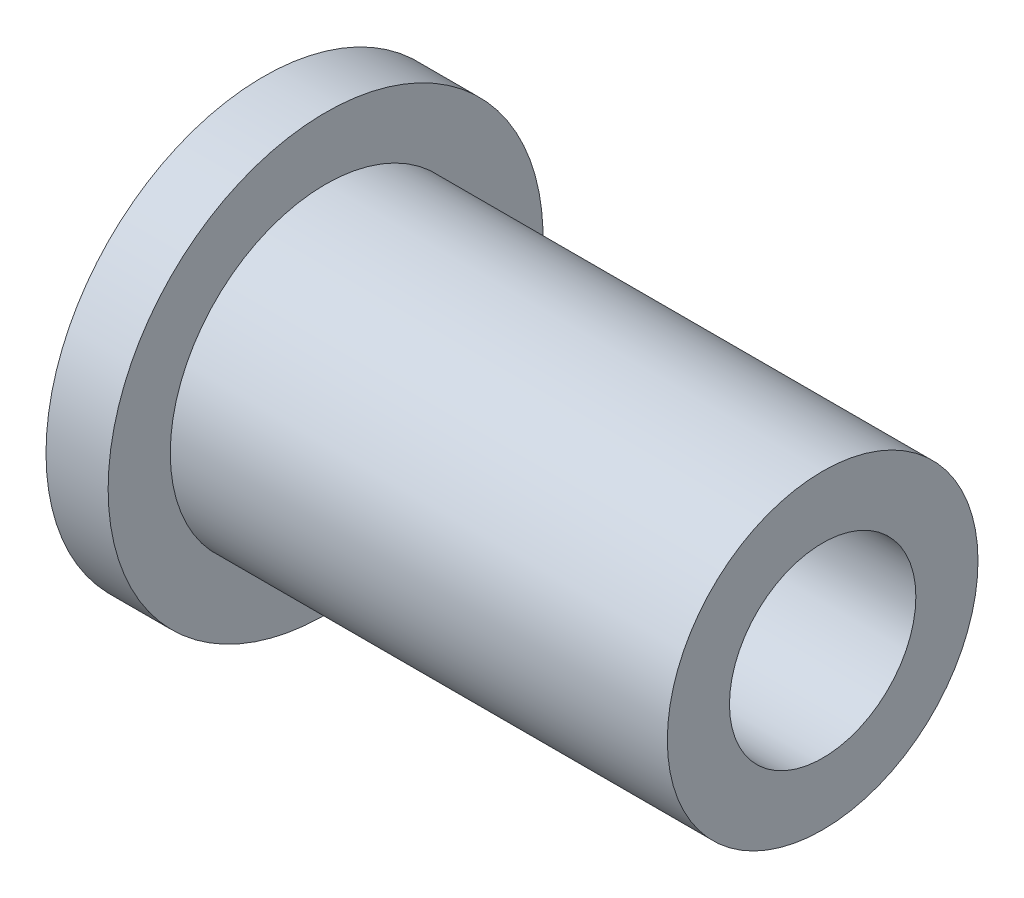
ISO-10303-21;
HEADER;
FILE_DESCRIPTION(('STEP AP214'),'2;1');
FILE_NAME('part.step','',(''),(''),'','','');
FILE_SCHEMA(('AUTOMOTIVE_DESIGN { 1 0 10303 214 1 1 1 1 }'));
ENDSEC;
DATA;
#1=APPLICATION_CONTEXT('core data for automotive mechanical design processes');
#2=APPLICATION_PROTOCOL_DEFINITION('international standard','automotive_design',2000,#1);
#3=PRODUCT_CONTEXT('',#1,'mechanical');
#4=PRODUCT('Part','Part','',(#3));
#5=PRODUCT_RELATED_PRODUCT_CATEGORY('part','',(#4));
#6=PRODUCT_DEFINITION_FORMATION('','',#4);
#7=PRODUCT_DEFINITION_CONTEXT('part definition',#1,'design');
#8=PRODUCT_DEFINITION('design','',#6,#7);
#9=PRODUCT_DEFINITION_SHAPE('','',#8);
#10=(LENGTH_UNIT() NAMED_UNIT(*) SI_UNIT(.MILLI.,.METRE.));
#11=(NAMED_UNIT(*) PLANE_ANGLE_UNIT() SI_UNIT($,.RADIAN.));
#12=(NAMED_UNIT(*) SI_UNIT($,.STERADIAN.) SOLID_ANGLE_UNIT());
#13=UNCERTAINTY_MEASURE_WITH_UNIT(LENGTH_MEASURE(1.E-05),#10,'distance_accuracy_value','');
#14=(GEOMETRIC_REPRESENTATION_CONTEXT(3) GLOBAL_UNCERTAINTY_ASSIGNED_CONTEXT((#13)) GLOBAL_UNIT_ASSIGNED_CONTEXT((#10,
#11,#12)) REPRESENTATION_CONTEXT('',''));
#15=CARTESIAN_POINT('',(0.,0.,0.));
#16=DIRECTION('',(0.,0.,1.));
#17=DIRECTION('',(1.,0.,0.));
#18=AXIS2_PLACEMENT_3D('',#15,#16,#17);
#19=CARTESIAN_POINT('',(12.7,0.,0.));
#20=DIRECTION('',(1.,0.,0.));
#21=DIRECTION('',(0.,0.,-1.));
#22=AXIS2_PLACEMENT_3D('',#19,#20,#21);
#23=PLANE('',#22);
#24=CARTESIAN_POINT('',(12.7,0.,0.));
#25=DIRECTION('',(1.,0.,0.));
#26=DIRECTION('',(0.,0.,-1.));
#27=AXIS2_PLACEMENT_3D('',#24,#25,#26);
#28=CIRCLE('',#27,3.96875);
#29=CARTESIAN_POINT('',(12.7,0.,-3.96875));
#30=VERTEX_POINT('',#29);
#31=EDGE_CURVE('E10',#30,#30,#28,.T.);
#32=ORIENTED_EDGE('',*,*,#31,.T.);
#33=EDGE_LOOP('',(#32));
#34=FACE_BOUND('',#33,.T.);
#35=CARTESIAN_POINT('',(12.7,0.,0.));
#36=DIRECTION('',(1.,0.,0.));
#37=DIRECTION('',(0.,0.,-1.));
#38=AXIS2_PLACEMENT_3D('',#35,#36,#37);
#39=CIRCLE('',#38,2.38125);
#40=CARTESIAN_POINT('',(12.7,0.,-2.38125));
#41=VERTEX_POINT('',#40);
#42=EDGE_CURVE('E38',#41,#41,#39,.T.);
#43=ORIENTED_EDGE('',*,*,#42,.F.);
#44=EDGE_LOOP('',(#43));
#45=FACE_BOUND('',#44,.T.);
#46=ADVANCED_FACE('F31',(#34,#45),#23,.T.);
#47=CARTESIAN_POINT('',(12.7,0.,0.));
#48=DIRECTION('',(-1.,0.,0.));
#49=DIRECTION('',(0.,0.,1.));
#50=AXIS2_PLACEMENT_3D('',#47,#48,#49);
#51=CYLINDRICAL_SURFACE('',#50,3.96875);
#52=ORIENTED_EDGE('',*,*,#31,.F.);
#53=EDGE_LOOP('',(#52));
#54=FACE_BOUND('',#53,.T.);
#55=CARTESIAN_POINT('',(0.,0.,0.));
#56=DIRECTION('',(-1.,0.,0.));
#57=DIRECTION('',(0.,0.,1.));
#58=AXIS2_PLACEMENT_3D('',#55,#56,#57);
#59=CIRCLE('',#58,3.96875);
#60=CARTESIAN_POINT('',(0.,0.,3.96875));
#61=VERTEX_POINT('',#60);
#62=EDGE_CURVE('E42',#61,#61,#59,.T.);
#63=ORIENTED_EDGE('',*,*,#62,.F.);
#64=EDGE_LOOP('',(#63));
#65=FACE_BOUND('',#64,.T.);
#66=ADVANCED_FACE('F33',(#54,#65),#51,.T.);
#67=CARTESIAN_POINT('',(12.7,0.,0.));
#68=DIRECTION('',(-1.,0.,0.));
#69=DIRECTION('',(0.,0.,1.));
#70=AXIS2_PLACEMENT_3D('',#67,#68,#69);
#71=CYLINDRICAL_SURFACE('',#70,2.38125);
#72=ORIENTED_EDGE('',*,*,#42,.T.);
#73=EDGE_LOOP('',(#72));
#74=FACE_BOUND('',#73,.T.);
#75=CARTESIAN_POINT('',(-1.5875,0.,0.));
#76=DIRECTION('',(-1.,0.,0.));
#77=DIRECTION('',(0.,0.,1.));
#78=AXIS2_PLACEMENT_3D('',#75,#76,#77);
#79=CIRCLE('',#78,2.38125);
#80=CARTESIAN_POINT('',(-1.5875,0.,2.38125));
#81=VERTEX_POINT('',#80);
#82=EDGE_CURVE('E52',#81,#81,#79,.T.);
#83=ORIENTED_EDGE('',*,*,#82,.T.);
#84=EDGE_LOOP('',(#83));
#85=FACE_BOUND('',#84,.T.);
#86=ADVANCED_FACE('F58',(#74,#85),#71,.F.);
#87=CARTESIAN_POINT('',(0.,0.,0.));
#88=DIRECTION('',(-1.,0.,0.));
#89=DIRECTION('',(0.,0.,1.));
#90=AXIS2_PLACEMENT_3D('',#87,#88,#89);
#91=PLANE('',#90);
#92=CARTESIAN_POINT('',(0.,0.,0.));
#93=DIRECTION('',(-1.,0.,0.));
#94=DIRECTION('',(0.,0.,1.));
#95=AXIS2_PLACEMENT_3D('',#92,#93,#94);
#96=CIRCLE('',#95,5.55625);
#97=CARTESIAN_POINT('',(0.,0.,5.55625));
#98=VERTEX_POINT('',#97);
#99=EDGE_CURVE('E49',#98,#98,#96,.T.);
#100=ORIENTED_EDGE('',*,*,#99,.F.);
#101=EDGE_LOOP('',(#100));
#102=FACE_BOUND('',#101,.T.);
#103=ORIENTED_EDGE('',*,*,#62,.T.);
#104=EDGE_LOOP('',(#103));
#105=FACE_BOUND('',#104,.T.);
#106=ADVANCED_FACE('F63',(#102,#105),#91,.F.);
#107=CARTESIAN_POINT('',(-1.5875,0.,0.));
#108=DIRECTION('',(-1.,0.,0.));
#109=DIRECTION('',(0.,0.,1.));
#110=AXIS2_PLACEMENT_3D('',#107,#108,#109);
#111=PLANE('',#110);
#112=CARTESIAN_POINT('',(-1.5875,0.,0.));
#113=DIRECTION('',(-1.,0.,0.));
#114=DIRECTION('',(0.,0.,1.));
#115=AXIS2_PLACEMENT_3D('',#112,#113,#114);
#116=CIRCLE('',#115,5.55625);
#117=CARTESIAN_POINT('',(-1.5875,0.,5.55625));
#118=VERTEX_POINT('',#117);
#119=EDGE_CURVE('E46',#118,#118,#116,.T.);
#120=ORIENTED_EDGE('',*,*,#119,.T.);
#121=EDGE_LOOP('',(#120));
#122=FACE_BOUND('',#121,.T.);
#123=ORIENTED_EDGE('',*,*,#82,.F.);
#124=EDGE_LOOP('',(#123));
#125=FACE_BOUND('',#124,.T.);
#126=ADVANCED_FACE('F60',(#122,#125),#111,.T.);
#127=CARTESIAN_POINT('',(-1.5875,0.,0.));
#128=DIRECTION('',(1.,0.,0.));
#129=DIRECTION('',(0.,0.,-1.));
#130=AXIS2_PLACEMENT_3D('',#127,#128,#129);
#131=CYLINDRICAL_SURFACE('',#130,5.55625);
#132=ORIENTED_EDGE('',*,*,#119,.F.);
#133=EDGE_LOOP('',(#132));
#134=FACE_BOUND('',#133,.T.);
#135=ORIENTED_EDGE('',*,*,#99,.T.);
#136=EDGE_LOOP('',(#135));
#137=FACE_BOUND('',#136,.T.);
#138=ADVANCED_FACE('F62',(#134,#137),#131,.T.);
#139=CLOSED_SHELL('',(#46,#66,#86,#106,#126,#138));
#140=MANIFOLD_SOLID_BREP('B2',#139);
#141=ADVANCED_BREP_SHAPE_REPRESENTATION('',(#18,#140),#14);
#142=SHAPE_DEFINITION_REPRESENTATION(#9,#141);
ENDSEC;
END-ISO-10303-21;
